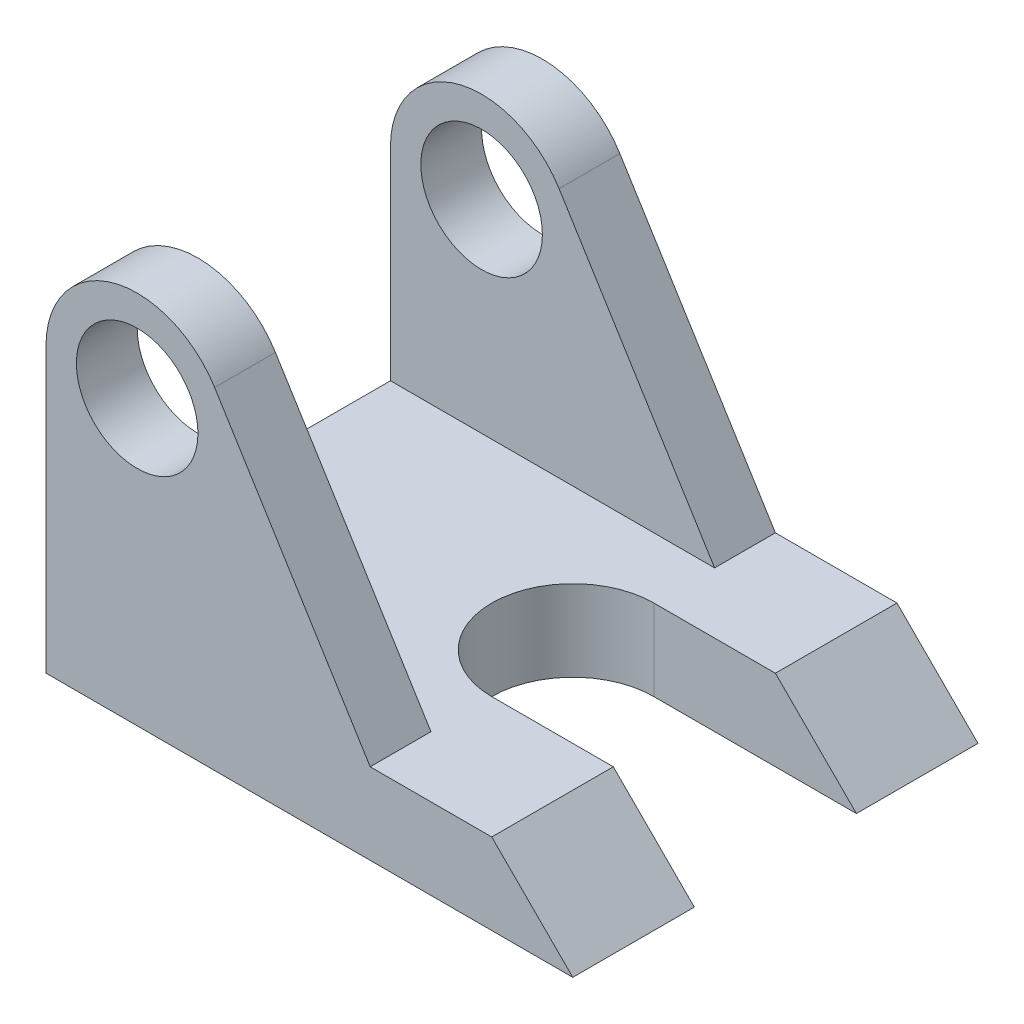
ISO-10303-21;
HEADER;
FILE_DESCRIPTION(('STEP AP214'),'2;1');
FILE_NAME('part.step','',(''),(''),'','','');
FILE_SCHEMA(('AUTOMOTIVE_DESIGN { 1 0 10303 214 1 1 1 1 }'));
ENDSEC;
DATA;
#1=APPLICATION_CONTEXT('core data for automotive mechanical design processes');
#2=APPLICATION_PROTOCOL_DEFINITION('international standard','automotive_design',2000,#1);
#3=PRODUCT_CONTEXT('',#1,'mechanical');
#4=PRODUCT('Part','Part','',(#3));
#5=PRODUCT_RELATED_PRODUCT_CATEGORY('part','',(#4));
#6=PRODUCT_DEFINITION_FORMATION('','',#4);
#7=PRODUCT_DEFINITION_CONTEXT('part definition',#1,'design');
#8=PRODUCT_DEFINITION('design','',#6,#7);
#9=PRODUCT_DEFINITION_SHAPE('','',#8);
#10=(LENGTH_UNIT() NAMED_UNIT(*) SI_UNIT(.MILLI.,.METRE.));
#11=(NAMED_UNIT(*) PLANE_ANGLE_UNIT() SI_UNIT($,.RADIAN.));
#12=(NAMED_UNIT(*) SI_UNIT($,.STERADIAN.) SOLID_ANGLE_UNIT());
#13=UNCERTAINTY_MEASURE_WITH_UNIT(LENGTH_MEASURE(1.E-05),#10,'distance_accuracy_value','');
#14=(GEOMETRIC_REPRESENTATION_CONTEXT(3) GLOBAL_UNCERTAINTY_ASSIGNED_CONTEXT((#13)) GLOBAL_UNIT_ASSIGNED_CONTEXT((#10,
#11,#12)) REPRESENTATION_CONTEXT('',''));
#15=CARTESIAN_POINT('',(0.,0.,0.));
#16=DIRECTION('',(0.,0.,1.));
#17=DIRECTION('',(1.,0.,0.));
#18=AXIS2_PLACEMENT_3D('',#15,#16,#17);
#19=CARTESIAN_POINT('',(130.,0.,50.));
#20=DIRECTION('',(-0.707106781186547,-0.707106781186548,0.));
#21=DIRECTION('',(0.707106781186548,-0.707106781186547,0.));
#22=AXIS2_PLACEMENT_3D('',#19,#20,#21);
#23=PLANE('',#22);
#24=DIRECTION('',(0.,0.,-1.));
#25=VECTOR('',#24,1.);
#26=CARTESIAN_POINT('',(110.,20.,50.));
#27=LINE('',#26,#25);
#28=CARTESIAN_POINT('',(110.,20.,-20.));
#29=VERTEX_POINT('',#28);
#30=CARTESIAN_POINT('',(110.,20.,-50.));
#31=VERTEX_POINT('',#30);
#32=EDGE_CURVE('E228',#29,#31,#27,.T.);
#33=ORIENTED_EDGE('',*,*,#32,.F.);
#34=DIRECTION('',(0.707106781186548,-0.707106781186547,0.));
#35=VECTOR('',#34,1.);
#36=CARTESIAN_POINT('',(130.,0.,-20.));
#37=LINE('',#36,#35);
#38=CARTESIAN_POINT('',(130.,0.,-20.));
#39=VERTEX_POINT('',#38);
#40=EDGE_CURVE('E11',#29,#39,#37,.T.);
#41=ORIENTED_EDGE('',*,*,#40,.T.);
#42=DIRECTION('',(0.,0.,-1.));
#43=VECTOR('',#42,1.);
#44=CARTESIAN_POINT('',(130.,0.,50.));
#45=LINE('',#44,#43);
#46=CARTESIAN_POINT('',(130.,0.,-50.));
#47=VERTEX_POINT('',#46);
#48=EDGE_CURVE('E235',#39,#47,#45,.T.);
#49=ORIENTED_EDGE('',*,*,#48,.T.);
#50=DIRECTION('',(-0.707106781186548,0.707106781186547,0.));
#51=VECTOR('',#50,1.);
#52=CARTESIAN_POINT('',(130.,0.,-50.));
#53=LINE('',#52,#51);
#54=EDGE_CURVE('E208',#47,#31,#53,.T.);
#55=ORIENTED_EDGE('',*,*,#54,.T.);
#56=EDGE_LOOP('',(#33,#41,#49,#55));
#57=FACE_BOUND('',#56,.T.);
#58=ADVANCED_FACE('F39',(#57),#23,.F.);
#59=CARTESIAN_POINT('',(110.,20.,50.));
#60=DIRECTION('',(0.,-1.,0.));
#61=DIRECTION('',(1.,0.,0.));
#62=AXIS2_PLACEMENT_3D('',#59,#60,#61);
#63=PLANE('',#62);
#64=DIRECTION('',(1.,0.,0.));
#65=VECTOR('',#64,1.);
#66=CARTESIAN_POINT('',(132.067444876783,20.,20.));
#67=LINE('',#66,#65);
#68=CARTESIAN_POINT('',(80.,20.,20.));
#69=VERTEX_POINT('',#68);
#70=CARTESIAN_POINT('',(110.,20.,20.));
#71=VERTEX_POINT('',#70);
#72=EDGE_CURVE('E161',#69,#71,#67,.T.);
#73=ORIENTED_EDGE('',*,*,#72,.F.);
#74=CARTESIAN_POINT('',(80.,20.,0.));
#75=DIRECTION('',(0.,1.,0.));
#76=DIRECTION('',(-1.,0.,0.));
#77=AXIS2_PLACEMENT_3D('',#74,#75,#76);
#78=CIRCLE('',#77,20.);
#79=CARTESIAN_POINT('',(80.,20.,-20.));
#80=VERTEX_POINT('',#79);
#81=EDGE_CURVE('E148',#80,#69,#78,.T.);
#82=ORIENTED_EDGE('',*,*,#81,.F.);
#83=DIRECTION('',(-1.,0.,0.));
#84=VECTOR('',#83,1.);
#85=CARTESIAN_POINT('',(80.,20.,-20.));
#86=LINE('',#85,#84);
#87=EDGE_CURVE('E168',#29,#80,#86,.T.);
#88=ORIENTED_EDGE('',*,*,#87,.F.);
#89=ORIENTED_EDGE('',*,*,#32,.T.);
#90=DIRECTION('',(-1.,0.,0.));
#91=VECTOR('',#90,1.);
#92=CARTESIAN_POINT('',(110.,20.,-50.));
#93=LINE('',#92,#91);
#94=CARTESIAN_POINT('',(80.,20.,-50.));
#95=VERTEX_POINT('',#94);
#96=EDGE_CURVE('E211',#31,#95,#93,.T.);
#97=ORIENTED_EDGE('',*,*,#96,.T.);
#98=DIRECTION('',(0.,0.,-1.));
#99=VECTOR('',#98,1.);
#100=CARTESIAN_POINT('',(80.,20.,50.));
#101=LINE('',#100,#99);
#102=CARTESIAN_POINT('',(80.,20.,-35.));
#103=VERTEX_POINT('',#102);
#104=EDGE_CURVE('E227',#103,#95,#101,.T.);
#105=ORIENTED_EDGE('',*,*,#104,.F.);
#106=DIRECTION('',(-1.,0.,0.));
#107=VECTOR('',#106,1.);
#108=CARTESIAN_POINT('',(-10.0135381285235,20.,-35.));
#109=LINE('',#108,#107);
#110=CARTESIAN_POINT('',(0.,20.,-35.));
#111=VERTEX_POINT('',#110);
#112=EDGE_CURVE('E179',#103,#111,#109,.T.);
#113=ORIENTED_EDGE('',*,*,#112,.T.);
#114=DIRECTION('',(0.,0.,1.));
#115=VECTOR('',#114,1.);
#116=CARTESIAN_POINT('',(0.,20.,50.));
#117=LINE('',#116,#115);
#118=CARTESIAN_POINT('',(0.,20.,35.));
#119=VERTEX_POINT('',#118);
#120=EDGE_CURVE('E175',#111,#119,#117,.T.);
#121=ORIENTED_EDGE('',*,*,#120,.T.);
#122=DIRECTION('',(1.,0.,0.));
#123=VECTOR('',#122,1.);
#124=CARTESIAN_POINT('',(-10.0135381285235,20.,35.));
#125=LINE('',#124,#123);
#126=CARTESIAN_POINT('',(80.,20.,35.));
#127=VERTEX_POINT('',#126);
#128=EDGE_CURVE('E174',#119,#127,#125,.T.);
#129=ORIENTED_EDGE('',*,*,#128,.T.);
#130=CARTESIAN_POINT('',(80.,20.,50.));
#131=VERTEX_POINT('',#130);
#132=EDGE_CURVE('E230',#131,#127,#101,.T.);
#133=ORIENTED_EDGE('',*,*,#132,.F.);
#134=DIRECTION('',(-1.,0.,0.));
#135=VECTOR('',#134,1.);
#136=CARTESIAN_POINT('',(110.,20.,50.));
#137=LINE('',#136,#135);
#138=CARTESIAN_POINT('',(110.,20.,50.));
#139=VERTEX_POINT('',#138);
#140=EDGE_CURVE('E198',#139,#131,#137,.T.);
#141=ORIENTED_EDGE('',*,*,#140,.F.);
#142=EDGE_CURVE('E233',#139,#71,#27,.T.);
#143=ORIENTED_EDGE('',*,*,#142,.T.);
#144=EDGE_LOOP('',(#73,#82,#88,#89,#97,#105,#113,#121,#129,#133,#141,#143));
#145=FACE_BOUND('',#144,.T.);
#146=ADVANCED_FACE('F253',(#145),#63,.F.);
#147=CARTESIAN_POINT('',(0.,0.,50.));
#148=DIRECTION('',(1.,0.,0.));
#149=DIRECTION('',(0.,0.,-1.));
#150=AXIS2_PLACEMENT_3D('',#147,#148,#149);
#151=PLANE('',#150);
#152=DIRECTION('',(0.,1.,0.));
#153=VECTOR('',#152,1.);
#154=CARTESIAN_POINT('',(0.,0.,35.));
#155=LINE('',#154,#153);
#156=CARTESIAN_POINT('',(0.,70.,35.));
#157=VERTEX_POINT('',#156);
#158=EDGE_CURVE('E183',#119,#157,#155,.T.);
#159=ORIENTED_EDGE('',*,*,#158,.F.);
#160=ORIENTED_EDGE('',*,*,#120,.F.);
#161=DIRECTION('',(0.,-1.,0.));
#162=VECTOR('',#161,1.);
#163=CARTESIAN_POINT('',(0.,0.,-35.));
#164=LINE('',#163,#162);
#165=CARTESIAN_POINT('',(0.,70.,-35.));
#166=VERTEX_POINT('',#165);
#167=EDGE_CURVE('E182',#166,#111,#164,.T.);
#168=ORIENTED_EDGE('',*,*,#167,.F.);
#169=DIRECTION('',(0.,0.,-1.));
#170=VECTOR('',#169,1.);
#171=CARTESIAN_POINT('',(0.,70.,50.));
#172=LINE('',#171,#170);
#173=CARTESIAN_POINT('',(0.,70.,-50.));
#174=VERTEX_POINT('',#173);
#175=EDGE_CURVE('E205',#166,#174,#172,.T.);
#176=ORIENTED_EDGE('',*,*,#175,.T.);
#177=DIRECTION('',(0.,-1.,0.));
#178=VECTOR('',#177,1.);
#179=CARTESIAN_POINT('',(0.,0.,-50.));
#180=LINE('',#179,#178);
#181=CARTESIAN_POINT('',(0.,0.,-50.));
#182=VERTEX_POINT('',#181);
#183=EDGE_CURVE('E190',#174,#182,#180,.T.);
#184=ORIENTED_EDGE('',*,*,#183,.T.);
#185=DIRECTION('',(0.,0.,-1.));
#186=VECTOR('',#185,1.);
#187=CARTESIAN_POINT('',(0.,0.,50.));
#188=LINE('',#187,#186);
#189=CARTESIAN_POINT('',(0.,0.,50.));
#190=VERTEX_POINT('',#189);
#191=EDGE_CURVE('E240',#190,#182,#188,.T.);
#192=ORIENTED_EDGE('',*,*,#191,.F.);
#193=DIRECTION('',(0.,-1.,0.));
#194=VECTOR('',#193,1.);
#195=CARTESIAN_POINT('',(0.,0.,50.));
#196=LINE('',#195,#194);
#197=CARTESIAN_POINT('',(0.,70.,50.));
#198=VERTEX_POINT('',#197);
#199=EDGE_CURVE('E189',#198,#190,#196,.T.);
#200=ORIENTED_EDGE('',*,*,#199,.F.);
#201=EDGE_CURVE('E218',#198,#157,#172,.T.);
#202=ORIENTED_EDGE('',*,*,#201,.T.);
#203=EDGE_LOOP('',(#159,#160,#168,#176,#184,#192,#200,#202));
#204=FACE_BOUND('',#203,.T.);
#205=ADVANCED_FACE('F41',(#204),#151,.F.);
#206=CARTESIAN_POINT('',(80.,20.,50.));
#207=DIRECTION('',(-0.849740356450421,-0.527201409917984,0.));
#208=DIRECTION('',(0.527201409917984,-0.849740356450421,0.));
#209=AXIS2_PLACEMENT_3D('',#206,#207,#208);
#210=PLANE('',#209);
#211=DIRECTION('',(0.527201409917984,-0.849740356450421,0.));
#212=VECTOR('',#211,1.);
#213=CARTESIAN_POINT('',(80.,20.,35.));
#214=LINE('',#213,#212);
#215=CARTESIAN_POINT('',(41.6191580201345,81.8620317231547,35.));
#216=VERTEX_POINT('',#215);
#217=EDGE_CURVE('E181',#216,#127,#214,.T.);
#218=ORIENTED_EDGE('',*,*,#217,.F.);
#219=DIRECTION('',(0.,0.,-1.));
#220=VECTOR('',#219,1.);
#221=CARTESIAN_POINT('',(41.6191580201345,81.8620317231547,50.));
#222=LINE('',#221,#220);
#223=CARTESIAN_POINT('',(41.6191580201345,81.8620317231547,50.));
#224=VERTEX_POINT('',#223);
#225=EDGE_CURVE('E224',#224,#216,#222,.T.);
#226=ORIENTED_EDGE('',*,*,#225,.F.);
#227=DIRECTION('',(-0.527201409917984,0.849740356450421,0.));
#228=VECTOR('',#227,1.);
#229=CARTESIAN_POINT('',(80.,20.,50.));
#230=LINE('',#229,#228);
#231=EDGE_CURVE('E196',#131,#224,#230,.T.);
#232=ORIENTED_EDGE('',*,*,#231,.F.);
#233=ORIENTED_EDGE('',*,*,#132,.T.);
#234=EDGE_LOOP('',(#218,#226,#232,#233));
#235=FACE_BOUND('',#234,.T.);
#236=ADVANCED_FACE('F290',(#235),#210,.F.);
#237=DIRECTION('',(-0.527201409917984,0.849740356450421,0.));
#238=VECTOR('',#237,1.);
#239=CARTESIAN_POINT('',(80.,20.,-35.));
#240=LINE('',#239,#238);
#241=CARTESIAN_POINT('',(41.6191580201345,81.8620317231547,-35.));
#242=VERTEX_POINT('',#241);
#243=EDGE_CURVE('E64',#103,#242,#240,.T.);
#244=ORIENTED_EDGE('',*,*,#243,.F.);
#245=ORIENTED_EDGE('',*,*,#104,.T.);
#246=DIRECTION('',(-0.527201409917984,0.849740356450421,0.));
#247=VECTOR('',#246,1.);
#248=CARTESIAN_POINT('',(80.,20.,-50.));
#249=LINE('',#248,#247);
#250=CARTESIAN_POINT('',(41.6191580201345,81.8620317231547,-50.));
#251=VERTEX_POINT('',#250);
#252=EDGE_CURVE('E212',#95,#251,#249,.T.);
#253=ORIENTED_EDGE('',*,*,#252,.T.);
#254=EDGE_CURVE('E225',#242,#251,#222,.T.);
#255=ORIENTED_EDGE('',*,*,#254,.F.);
#256=EDGE_LOOP('',(#244,#245,#253,#255));
#257=FACE_BOUND('',#256,.T.);
#258=ADVANCED_FACE('F279',(#257),#210,.F.);
#259=CARTESIAN_POINT('',(22.5,70.,50.));
#260=DIRECTION('',(0.,0.,-1.));
#261=DIRECTION('',(-1.,0.,0.));
#262=AXIS2_PLACEMENT_3D('',#259,#260,#261);
#263=CYLINDRICAL_SURFACE('',#262,22.5);
#264=ORIENTED_EDGE('',*,*,#225,.T.);
#265=CARTESIAN_POINT('',(22.5,70.,35.));
#266=DIRECTION('',(0.,0.,-1.));
#267=DIRECTION('',(-1.,0.,0.));
#268=AXIS2_PLACEMENT_3D('',#265,#266,#267);
#269=CIRCLE('',#268,22.5);
#270=EDGE_CURVE('E245',#157,#216,#269,.T.);
#271=ORIENTED_EDGE('',*,*,#270,.F.);
#272=ORIENTED_EDGE('',*,*,#201,.F.);
#273=CARTESIAN_POINT('',(22.5,70.,50.));
#274=DIRECTION('',(0.,0.,1.));
#275=DIRECTION('',(-1.,0.,0.));
#276=AXIS2_PLACEMENT_3D('',#273,#274,#275);
#277=CIRCLE('',#276,22.5);
#278=EDGE_CURVE('E199',#224,#198,#277,.T.);
#279=ORIENTED_EDGE('',*,*,#278,.F.);
#280=EDGE_LOOP('',(#264,#271,#272,#279));
#281=FACE_BOUND('',#280,.T.);
#282=ADVANCED_FACE('F295',(#281),#263,.T.);
#283=ORIENTED_EDGE('',*,*,#175,.F.);
#284=CARTESIAN_POINT('',(22.5,70.,-35.));
#285=DIRECTION('',(0.,0.,1.));
#286=DIRECTION('',(1.,0.,0.));
#287=AXIS2_PLACEMENT_3D('',#284,#285,#286);
#288=CIRCLE('',#287,22.5);
#289=EDGE_CURVE('E238',#242,#166,#288,.T.);
#290=ORIENTED_EDGE('',*,*,#289,.F.);
#291=ORIENTED_EDGE('',*,*,#254,.T.);
#292=CARTESIAN_POINT('',(22.5,70.,-50.));
#293=DIRECTION('',(0.,0.,1.));
#294=DIRECTION('',(-1.,0.,0.));
#295=AXIS2_PLACEMENT_3D('',#292,#293,#294);
#296=CIRCLE('',#295,22.5);
#297=EDGE_CURVE('E194',#251,#174,#296,.T.);
#298=ORIENTED_EDGE('',*,*,#297,.T.);
#299=EDGE_LOOP('',(#283,#290,#291,#298));
#300=FACE_BOUND('',#299,.T.);
#301=ADVANCED_FACE('F278',(#300),#263,.T.);
#302=CARTESIAN_POINT('',(0.,0.,50.));
#303=DIRECTION('',(0.,1.,0.));
#304=DIRECTION('',(0.,0.,1.));
#305=AXIS2_PLACEMENT_3D('',#302,#303,#304);
#306=PLANE('',#305);
#307=ORIENTED_EDGE('',*,*,#48,.F.);
#308=DIRECTION('',(-1.,0.,0.));
#309=VECTOR('',#308,1.);
#310=CARTESIAN_POINT('',(80.,0.,-20.));
#311=LINE('',#310,#309);
#312=CARTESIAN_POINT('',(80.,0.,-20.));
#313=VERTEX_POINT('',#312);
#314=EDGE_CURVE('E149',#39,#313,#311,.T.);
#315=ORIENTED_EDGE('',*,*,#314,.T.);
#316=CARTESIAN_POINT('',(80.,0.,0.));
#317=DIRECTION('',(0.,1.,0.));
#318=DIRECTION('',(-1.,0.,0.));
#319=AXIS2_PLACEMENT_3D('',#316,#317,#318);
#320=CIRCLE('',#319,20.);
#321=CARTESIAN_POINT('',(80.,0.,20.));
#322=VERTEX_POINT('',#321);
#323=EDGE_CURVE('E141',#313,#322,#320,.T.);
#324=ORIENTED_EDGE('',*,*,#323,.T.);
#325=DIRECTION('',(1.,0.,0.));
#326=VECTOR('',#325,1.);
#327=CARTESIAN_POINT('',(132.067444876783,0.,20.));
#328=LINE('',#327,#326);
#329=CARTESIAN_POINT('',(130.,0.,20.));
#330=VERTEX_POINT('',#329);
#331=EDGE_CURVE('E155',#322,#330,#328,.T.);
#332=ORIENTED_EDGE('',*,*,#331,.T.);
#333=CARTESIAN_POINT('',(130.,0.,50.));
#334=VERTEX_POINT('',#333);
#335=EDGE_CURVE('E231',#334,#330,#45,.T.);
#336=ORIENTED_EDGE('',*,*,#335,.F.);
#337=DIRECTION('',(1.,0.,0.));
#338=VECTOR('',#337,1.);
#339=CARTESIAN_POINT('',(0.,0.,50.));
#340=LINE('',#339,#338);
#341=EDGE_CURVE('E193',#190,#334,#340,.T.);
#342=ORIENTED_EDGE('',*,*,#341,.F.);
#343=ORIENTED_EDGE('',*,*,#191,.T.);
#344=DIRECTION('',(1.,0.,0.));
#345=VECTOR('',#344,1.);
#346=CARTESIAN_POINT('',(0.,0.,-50.));
#347=LINE('',#346,#345);
#348=EDGE_CURVE('E202',#182,#47,#347,.T.);
#349=ORIENTED_EDGE('',*,*,#348,.T.);
#350=EDGE_LOOP('',(#307,#315,#324,#332,#336,#342,#343,#349));
#351=FACE_BOUND('',#350,.T.);
#352=ADVANCED_FACE('F159',(#351),#306,.F.);
#353=ORIENTED_EDGE('',*,*,#335,.T.);
#354=DIRECTION('',(-0.707106781186548,0.707106781186547,0.));
#355=VECTOR('',#354,1.);
#356=CARTESIAN_POINT('',(130.,0.,20.));
#357=LINE('',#356,#355);
#358=EDGE_CURVE('E48',#330,#71,#357,.T.);
#359=ORIENTED_EDGE('',*,*,#358,.T.);
#360=ORIENTED_EDGE('',*,*,#142,.F.);
#361=DIRECTION('',(-0.707106781186548,0.707106781186547,0.));
#362=VECTOR('',#361,1.);
#363=CARTESIAN_POINT('',(130.,0.,50.));
#364=LINE('',#363,#362);
#365=EDGE_CURVE('E195',#334,#139,#364,.T.);
#366=ORIENTED_EDGE('',*,*,#365,.F.);
#367=EDGE_LOOP('',(#353,#359,#360,#366));
#368=FACE_BOUND('',#367,.T.);
#369=ADVANCED_FACE('F249',(#368),#23,.F.);
#370=CARTESIAN_POINT('',(22.5,70.,50.));
#371=DIRECTION('',(0.,0.,-1.));
#372=DIRECTION('',(-1.,0.,0.));
#373=AXIS2_PLACEMENT_3D('',#370,#371,#372);
#374=PLANE('',#373);
#375=CARTESIAN_POINT('',(22.5,70.,50.));
#376=DIRECTION('',(0.,0.,1.));
#377=DIRECTION('',(1.,0.,0.));
#378=AXIS2_PLACEMENT_3D('',#375,#376,#377);
#379=CIRCLE('',#378,15.);
#380=CARTESIAN_POINT('',(37.5,70.,50.));
#381=VERTEX_POINT('',#380);
#382=EDGE_CURVE('E443',#381,#381,#379,.T.);
#383=ORIENTED_EDGE('',*,*,#382,.F.);
#384=EDGE_LOOP('',(#383));
#385=FACE_BOUND('',#384,.T.);
#386=ORIENTED_EDGE('',*,*,#199,.T.);
#387=ORIENTED_EDGE('',*,*,#341,.T.);
#388=ORIENTED_EDGE('',*,*,#365,.T.);
#389=ORIENTED_EDGE('',*,*,#140,.T.);
#390=ORIENTED_EDGE('',*,*,#231,.T.);
#391=ORIENTED_EDGE('',*,*,#278,.T.);
#392=EDGE_LOOP('',(#386,#387,#388,#389,#390,#391));
#393=FACE_BOUND('',#392,.T.);
#394=ADVANCED_FACE('F254',(#385,#393),#374,.F.);
#395=CARTESIAN_POINT('',(22.5,70.,-50.));
#396=DIRECTION('',(0.,0.,-1.));
#397=DIRECTION('',(-1.,0.,0.));
#398=AXIS2_PLACEMENT_3D('',#395,#396,#397);
#399=PLANE('',#398);
#400=CARTESIAN_POINT('',(22.5,70.,-50.));
#401=DIRECTION('',(0.,0.,1.));
#402=DIRECTION('',(1.,0.,0.));
#403=AXIS2_PLACEMENT_3D('',#400,#401,#402);
#404=CIRCLE('',#403,15.);
#405=CARTESIAN_POINT('',(37.5,70.,-50.));
#406=VERTEX_POINT('',#405);
#407=EDGE_CURVE('E444',#406,#406,#404,.T.);
#408=ORIENTED_EDGE('',*,*,#407,.T.);
#409=EDGE_LOOP('',(#408));
#410=FACE_BOUND('',#409,.T.);
#411=ORIENTED_EDGE('',*,*,#183,.F.);
#412=ORIENTED_EDGE('',*,*,#297,.F.);
#413=ORIENTED_EDGE('',*,*,#252,.F.);
#414=ORIENTED_EDGE('',*,*,#96,.F.);
#415=ORIENTED_EDGE('',*,*,#54,.F.);
#416=ORIENTED_EDGE('',*,*,#348,.F.);
#417=EDGE_LOOP('',(#411,#412,#413,#414,#415,#416));
#418=FACE_BOUND('',#417,.T.);
#419=ADVANCED_FACE('F270',(#410,#418),#399,.T.);
#420=CARTESIAN_POINT('',(-10.0135381285235,92.5,35.));
#421=DIRECTION('',(0.,0.,-1.));
#422=DIRECTION('',(-1.,0.,0.));
#423=AXIS2_PLACEMENT_3D('',#420,#421,#422);
#424=PLANE('',#423);
#425=CARTESIAN_POINT('',(22.5,70.,35.));
#426=DIRECTION('',(0.,0.,-1.));
#427=DIRECTION('',(-1.,0.,0.));
#428=AXIS2_PLACEMENT_3D('',#425,#426,#427);
#429=CIRCLE('',#428,15.);
#430=CARTESIAN_POINT('',(7.50000000000002,70.,35.));
#431=VERTEX_POINT('',#430);
#432=EDGE_CURVE('E164',#431,#431,#429,.T.);
#433=ORIENTED_EDGE('',*,*,#432,.F.);
#434=EDGE_LOOP('',(#433));
#435=FACE_BOUND('',#434,.T.);
#436=ORIENTED_EDGE('',*,*,#158,.T.);
#437=ORIENTED_EDGE('',*,*,#270,.T.);
#438=ORIENTED_EDGE('',*,*,#217,.T.);
#439=ORIENTED_EDGE('',*,*,#128,.F.);
#440=EDGE_LOOP('',(#436,#437,#438,#439));
#441=FACE_BOUND('',#440,.T.);
#442=ADVANCED_FACE('F283',(#435,#441),#424,.T.);
#443=CARTESIAN_POINT('',(-10.0135381285235,92.5,-35.));
#444=DIRECTION('',(0.,0.,1.));
#445=DIRECTION('',(1.,0.,0.));
#446=AXIS2_PLACEMENT_3D('',#443,#444,#445);
#447=PLANE('',#446);
#448=CARTESIAN_POINT('',(22.5,70.,-35.));
#449=DIRECTION('',(0.,0.,1.));
#450=DIRECTION('',(1.,0.,0.));
#451=AXIS2_PLACEMENT_3D('',#448,#449,#450);
#452=CIRCLE('',#451,15.);
#453=CARTESIAN_POINT('',(37.5,70.,-35.));
#454=VERTEX_POINT('',#453);
#455=EDGE_CURVE('E43',#454,#454,#452,.T.);
#456=ORIENTED_EDGE('',*,*,#455,.F.);
#457=EDGE_LOOP('',(#456));
#458=FACE_BOUND('',#457,.T.);
#459=ORIENTED_EDGE('',*,*,#167,.T.);
#460=ORIENTED_EDGE('',*,*,#112,.F.);
#461=ORIENTED_EDGE('',*,*,#243,.T.);
#462=ORIENTED_EDGE('',*,*,#289,.T.);
#463=EDGE_LOOP('',(#459,#460,#461,#462));
#464=FACE_BOUND('',#463,.T.);
#465=ADVANCED_FACE('F282',(#458,#464),#447,.T.);
#466=CARTESIAN_POINT('',(80.,0.,-20.));
#467=DIRECTION('',(0.,0.,-1.));
#468=DIRECTION('',(-1.,0.,0.));
#469=AXIS2_PLACEMENT_3D('',#466,#467,#468);
#470=PLANE('',#469);
#471=ORIENTED_EDGE('',*,*,#87,.T.);
#472=DIRECTION('',(0.,1.,0.));
#473=VECTOR('',#472,1.);
#474=CARTESIAN_POINT('',(80.,0.,-20.));
#475=LINE('',#474,#473);
#476=EDGE_CURVE('E54',#313,#80,#475,.T.);
#477=ORIENTED_EDGE('',*,*,#476,.F.);
#478=ORIENTED_EDGE('',*,*,#314,.F.);
#479=ORIENTED_EDGE('',*,*,#40,.F.);
#480=EDGE_LOOP('',(#471,#477,#478,#479));
#481=FACE_BOUND('',#480,.T.);
#482=ADVANCED_FACE('F273',(#481),#470,.F.);
#483=CARTESIAN_POINT('',(132.067444876783,0.,20.));
#484=DIRECTION('',(0.,0.,1.));
#485=DIRECTION('',(1.,0.,0.));
#486=AXIS2_PLACEMENT_3D('',#483,#484,#485);
#487=PLANE('',#486);
#488=ORIENTED_EDGE('',*,*,#331,.F.);
#489=DIRECTION('',(0.,1.,0.));
#490=VECTOR('',#489,1.);
#491=CARTESIAN_POINT('',(80.,0.,20.));
#492=LINE('',#491,#490);
#493=EDGE_CURVE('E140',#322,#69,#492,.T.);
#494=ORIENTED_EDGE('',*,*,#493,.T.);
#495=ORIENTED_EDGE('',*,*,#72,.T.);
#496=ORIENTED_EDGE('',*,*,#358,.F.);
#497=EDGE_LOOP('',(#488,#494,#495,#496));
#498=FACE_BOUND('',#497,.T.);
#499=ADVANCED_FACE('F153',(#498),#487,.F.);
#500=CARTESIAN_POINT('',(80.,0.,0.));
#501=DIRECTION('',(0.,1.,0.));
#502=DIRECTION('',(-1.,0.,0.));
#503=AXIS2_PLACEMENT_3D('',#500,#501,#502);
#504=CYLINDRICAL_SURFACE('',#503,20.);
#505=ORIENTED_EDGE('',*,*,#81,.T.);
#506=ORIENTED_EDGE('',*,*,#493,.F.);
#507=ORIENTED_EDGE('',*,*,#323,.F.);
#508=ORIENTED_EDGE('',*,*,#476,.T.);
#509=EDGE_LOOP('',(#505,#506,#507,#508));
#510=FACE_BOUND('',#509,.T.);
#511=ADVANCED_FACE('F143',(#510),#504,.F.);
#512=CARTESIAN_POINT('',(22.5,70.,50.));
#513=DIRECTION('',(0.,0.,1.));
#514=DIRECTION('',(1.,0.,0.));
#515=AXIS2_PLACEMENT_3D('',#512,#513,#514);
#516=CYLINDRICAL_SURFACE('',#515,15.);
#517=ORIENTED_EDGE('',*,*,#455,.T.);
#518=EDGE_LOOP('',(#517));
#519=FACE_BOUND('',#518,.T.);
#520=ORIENTED_EDGE('',*,*,#407,.F.);
#521=EDGE_LOOP('',(#520));
#522=FACE_BOUND('',#521,.T.);
#523=ADVANCED_FACE('F351',(#519,#522),#516,.F.);
#524=ORIENTED_EDGE('',*,*,#432,.T.);
#525=EDGE_LOOP('',(#524));
#526=FACE_BOUND('',#525,.T.);
#527=ORIENTED_EDGE('',*,*,#382,.T.);
#528=EDGE_LOOP('',(#527));
#529=FACE_BOUND('',#528,.T.);
#530=ADVANCED_FACE('F362',(#526,#529),#516,.F.);
#531=CLOSED_SHELL('',(#58,#146,#205,#236,#258,#282,#301,#352,#369,#394,#419,#442,#465,#482,#499,
#511,#523,#530));
#532=MANIFOLD_SOLID_BREP('B2',#531);
#533=ADVANCED_BREP_SHAPE_REPRESENTATION('',(#18,#532),#14);
#534=SHAPE_DEFINITION_REPRESENTATION(#9,#533);
ENDSEC;
END-ISO-10303-21;
